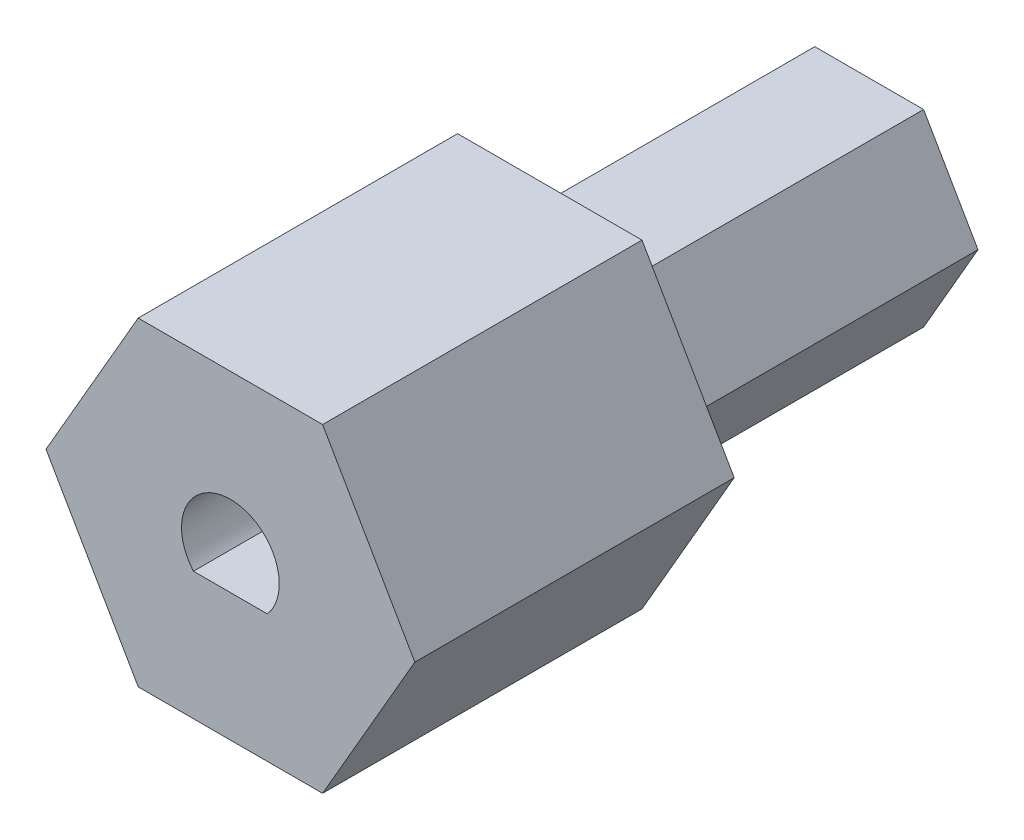
ISO-10303-21;
HEADER;
FILE_DESCRIPTION(('STEP AP214'),'2;1');
FILE_NAME('part.step','',(''),(''),'','','');
FILE_SCHEMA(('AUTOMOTIVE_DESIGN { 1 0 10303 214 1 1 1 1 }'));
ENDSEC;
DATA;
#1=APPLICATION_CONTEXT('core data for automotive mechanical design processes');
#2=APPLICATION_PROTOCOL_DEFINITION('international standard','automotive_design',2000,#1);
#3=PRODUCT_CONTEXT('',#1,'mechanical');
#4=PRODUCT('Part','Part','',(#3));
#5=PRODUCT_RELATED_PRODUCT_CATEGORY('part','',(#4));
#6=PRODUCT_DEFINITION_FORMATION('','',#4);
#7=PRODUCT_DEFINITION_CONTEXT('part definition',#1,'design');
#8=PRODUCT_DEFINITION('design','',#6,#7);
#9=PRODUCT_DEFINITION_SHAPE('','',#8);
#10=(LENGTH_UNIT() NAMED_UNIT(*) SI_UNIT(.MILLI.,.METRE.));
#11=(NAMED_UNIT(*) PLANE_ANGLE_UNIT() SI_UNIT($,.RADIAN.));
#12=(NAMED_UNIT(*) SI_UNIT($,.STERADIAN.) SOLID_ANGLE_UNIT());
#13=UNCERTAINTY_MEASURE_WITH_UNIT(LENGTH_MEASURE(1.E-05),#10,'distance_accuracy_value','');
#14=(GEOMETRIC_REPRESENTATION_CONTEXT(3) GLOBAL_UNCERTAINTY_ASSIGNED_CONTEXT((#13)) GLOBAL_UNIT_ASSIGNED_CONTEXT((#10,
#11,#12)) REPRESENTATION_CONTEXT('',''));
#15=CARTESIAN_POINT('',(0.,0.,0.));
#16=DIRECTION('',(0.,0.,1.));
#17=DIRECTION('',(1.,0.,0.));
#18=AXIS2_PLACEMENT_3D('',#15,#16,#17);
#19=CARTESIAN_POINT('',(0.,0.,20.));
#20=DIRECTION('',(0.,0.,1.));
#21=DIRECTION('',(1.,0.,0.));
#22=AXIS2_PLACEMENT_3D('',#19,#20,#21);
#23=PLANE('',#22);
#24=DIRECTION('',(-0.5,-0.866025403784439,0.));
#25=VECTOR('',#24,1.);
#26=CARTESIAN_POINT('',(-2.88675134594813,5.,20.));
#27=LINE('',#26,#25);
#28=CARTESIAN_POINT('',(-2.88675134594813,5.,20.));
#29=VERTEX_POINT('',#28);
#30=CARTESIAN_POINT('',(-5.77350269189626,0.,20.));
#31=VERTEX_POINT('',#30);
#32=EDGE_CURVE('E153',#29,#31,#27,.T.);
#33=ORIENTED_EDGE('',*,*,#32,.T.);
#34=DIRECTION('',(0.5,-0.866025403784439,0.));
#35=VECTOR('',#34,1.);
#36=CARTESIAN_POINT('',(-5.77350269189626,0.,20.));
#37=LINE('',#36,#35);
#38=CARTESIAN_POINT('',(-2.88675134594813,-5.,20.));
#39=VERTEX_POINT('',#38);
#40=EDGE_CURVE('E177',#31,#39,#37,.T.);
#41=ORIENTED_EDGE('',*,*,#40,.T.);
#42=DIRECTION('',(1.,0.,0.));
#43=VECTOR('',#42,1.);
#44=CARTESIAN_POINT('',(-2.88675134594813,-5.,20.));
#45=LINE('',#44,#43);
#46=CARTESIAN_POINT('',(2.88675134594813,-5.,20.));
#47=VERTEX_POINT('',#46);
#48=EDGE_CURVE('E180',#39,#47,#45,.T.);
#49=ORIENTED_EDGE('',*,*,#48,.T.);
#50=DIRECTION('',(0.5,0.866025403784439,0.));
#51=VECTOR('',#50,1.);
#52=CARTESIAN_POINT('',(2.88675134594813,-5.,20.));
#53=LINE('',#52,#51);
#54=CARTESIAN_POINT('',(5.77350269189626,0.,20.));
#55=VERTEX_POINT('',#54);
#56=EDGE_CURVE('E183',#47,#55,#53,.T.);
#57=ORIENTED_EDGE('',*,*,#56,.T.);
#58=DIRECTION('',(-0.5,0.866025403784438,0.));
#59=VECTOR('',#58,1.);
#60=CARTESIAN_POINT('',(5.77350269189626,0.,20.));
#61=LINE('',#60,#59);
#62=CARTESIAN_POINT('',(2.88675134594813,5.,20.));
#63=VERTEX_POINT('',#62);
#64=EDGE_CURVE('E186',#55,#63,#61,.T.);
#65=ORIENTED_EDGE('',*,*,#64,.T.);
#66=DIRECTION('',(-1.,0.,0.));
#67=VECTOR('',#66,1.);
#68=CARTESIAN_POINT('',(2.88675134594813,5.,20.));
#69=LINE('',#68,#67);
#70=EDGE_CURVE('E159',#63,#29,#69,.T.);
#71=ORIENTED_EDGE('',*,*,#70,.T.);
#72=EDGE_LOOP('',(#33,#41,#49,#57,#65,#71));
#73=FACE_BOUND('',#72,.T.);
#74=DIRECTION('',(1.,0.,0.));
#75=VECTOR('',#74,1.);
#76=CARTESIAN_POINT('',(-1.1579723658188,-1.,20.));
#77=LINE('',#76,#75);
#78=CARTESIAN_POINT('',(-1.1579723658188,-1.,20.));
#79=VERTEX_POINT('',#78);
#80=CARTESIAN_POINT('',(1.1579723658188,-1.,20.));
#81=VERTEX_POINT('',#80);
#82=EDGE_CURVE('E47',#79,#81,#77,.T.);
#83=ORIENTED_EDGE('',*,*,#82,.F.);
#84=CARTESIAN_POINT('',(0.,0.,20.));
#85=DIRECTION('',(0.,0.,-1.));
#86=DIRECTION('',(-1.,0.,0.));
#87=AXIS2_PLACEMENT_3D('',#84,#85,#86);
#88=CIRCLE('',#87,1.53);
#89=EDGE_CURVE('E148',#79,#81,#88,.T.);
#90=ORIENTED_EDGE('',*,*,#89,.T.);
#91=EDGE_LOOP('',(#83,#90));
#92=FACE_BOUND('',#91,.T.);
#93=ADVANCED_FACE('F32',(#73,#92),#23,.T.);
#94=CARTESIAN_POINT('',(1.7031832941094,-2.95,20.));
#95=DIRECTION('',(-0.866025403784439,0.5,0.));
#96=DIRECTION('',(-0.5,-0.866025403784439,0.));
#97=AXIS2_PLACEMENT_3D('',#94,#95,#96);
#98=PLANE('',#97);
#99=DIRECTION('',(0.5,0.866025403784439,0.));
#100=VECTOR('',#99,1.);
#101=CARTESIAN_POINT('',(1.7031832941094,-2.95,10.));
#102=LINE('',#101,#100);
#103=CARTESIAN_POINT('',(1.7031832941094,-2.95,10.));
#104=VERTEX_POINT('',#103);
#105=CARTESIAN_POINT('',(3.40636658821879,0.,10.));
#106=VERTEX_POINT('',#105);
#107=EDGE_CURVE('E212',#104,#106,#102,.T.);
#108=ORIENTED_EDGE('',*,*,#107,.F.);
#109=DIRECTION('',(0.,0.,-1.));
#110=VECTOR('',#109,1.);
#111=CARTESIAN_POINT('',(1.7031832941094,-2.95,20.));
#112=LINE('',#111,#110);
#113=CARTESIAN_POINT('',(1.7031832941094,-2.95,0.));
#114=VERTEX_POINT('',#113);
#115=EDGE_CURVE('E233',#104,#114,#112,.T.);
#116=ORIENTED_EDGE('',*,*,#115,.T.);
#117=DIRECTION('',(0.5,0.866025403784438,0.));
#118=VECTOR('',#117,1.);
#119=CARTESIAN_POINT('',(1.7031832941094,-2.95,0.));
#120=LINE('',#119,#118);
#121=CARTESIAN_POINT('',(3.40636658821879,0.,0.));
#122=VERTEX_POINT('',#121);
#123=EDGE_CURVE('E215',#114,#122,#120,.T.);
#124=ORIENTED_EDGE('',*,*,#123,.T.);
#125=DIRECTION('',(0.,0.,-1.));
#126=VECTOR('',#125,1.);
#127=CARTESIAN_POINT('',(3.40636658821879,0.,20.));
#128=LINE('',#127,#126);
#129=EDGE_CURVE('E40',#106,#122,#128,.T.);
#130=ORIENTED_EDGE('',*,*,#129,.F.);
#131=EDGE_LOOP('',(#108,#116,#124,#130));
#132=FACE_BOUND('',#131,.T.);
#133=ADVANCED_FACE('F34',(#132),#98,.F.);
#134=CARTESIAN_POINT('',(3.40636658821879,0.,20.));
#135=DIRECTION('',(-0.866025403784438,-0.5,0.));
#136=DIRECTION('',(0.5,-0.866025403784438,0.));
#137=AXIS2_PLACEMENT_3D('',#134,#135,#136);
#138=PLANE('',#137);
#139=DIRECTION('',(-0.5,0.866025403784438,0.));
#140=VECTOR('',#139,1.);
#141=CARTESIAN_POINT('',(3.40636658821879,0.,10.));
#142=LINE('',#141,#140);
#143=CARTESIAN_POINT('',(1.7031832941094,2.95,10.));
#144=VERTEX_POINT('',#143);
#145=EDGE_CURVE('E55',#106,#144,#142,.T.);
#146=ORIENTED_EDGE('',*,*,#145,.F.);
#147=ORIENTED_EDGE('',*,*,#129,.T.);
#148=DIRECTION('',(-0.5,0.866025403784438,0.));
#149=VECTOR('',#148,1.);
#150=CARTESIAN_POINT('',(3.40636658821879,0.,0.));
#151=LINE('',#150,#149);
#152=CARTESIAN_POINT('',(1.7031832941094,2.95,0.));
#153=VERTEX_POINT('',#152);
#154=EDGE_CURVE('E218',#122,#153,#151,.T.);
#155=ORIENTED_EDGE('',*,*,#154,.T.);
#156=DIRECTION('',(0.,0.,-1.));
#157=VECTOR('',#156,1.);
#158=CARTESIAN_POINT('',(1.7031832941094,2.95,20.));
#159=LINE('',#158,#157);
#160=EDGE_CURVE('E241',#144,#153,#159,.T.);
#161=ORIENTED_EDGE('',*,*,#160,.F.);
#162=EDGE_LOOP('',(#146,#147,#155,#161));
#163=FACE_BOUND('',#162,.T.);
#164=ADVANCED_FACE('F243',(#163),#138,.F.);
#165=CARTESIAN_POINT('',(1.7031832941094,2.95,20.));
#166=DIRECTION('',(0.,-1.,0.));
#167=DIRECTION('',(0.,0.,-1.));
#168=AXIS2_PLACEMENT_3D('',#165,#166,#167);
#169=PLANE('',#168);
#170=DIRECTION('',(-1.,0.,0.));
#171=VECTOR('',#170,1.);
#172=CARTESIAN_POINT('',(1.7031832941094,2.95,10.));
#173=LINE('',#172,#171);
#174=CARTESIAN_POINT('',(-1.7031832941094,2.95,10.));
#175=VERTEX_POINT('',#174);
#176=EDGE_CURVE('E208',#144,#175,#173,.T.);
#177=ORIENTED_EDGE('',*,*,#176,.F.);
#178=ORIENTED_EDGE('',*,*,#160,.T.);
#179=DIRECTION('',(-1.,0.,0.));
#180=VECTOR('',#179,1.);
#181=CARTESIAN_POINT('',(1.7031832941094,2.95,0.));
#182=LINE('',#181,#180);
#183=CARTESIAN_POINT('',(-1.7031832941094,2.95,0.));
#184=VERTEX_POINT('',#183);
#185=EDGE_CURVE('E221',#153,#184,#182,.T.);
#186=ORIENTED_EDGE('',*,*,#185,.T.);
#187=DIRECTION('',(0.,0.,-1.));
#188=VECTOR('',#187,1.);
#189=CARTESIAN_POINT('',(-1.7031832941094,2.95,20.));
#190=LINE('',#189,#188);
#191=EDGE_CURVE('E239',#175,#184,#190,.T.);
#192=ORIENTED_EDGE('',*,*,#191,.F.);
#193=EDGE_LOOP('',(#177,#178,#186,#192));
#194=FACE_BOUND('',#193,.T.);
#195=ADVANCED_FACE('F263',(#194),#169,.F.);
#196=CARTESIAN_POINT('',(-1.7031832941094,2.95,20.));
#197=DIRECTION('',(0.866025403784439,-0.5,0.));
#198=DIRECTION('',(0.5,0.866025403784439,0.));
#199=AXIS2_PLACEMENT_3D('',#196,#197,#198);
#200=PLANE('',#199);
#201=DIRECTION('',(-0.5,-0.866025403784439,0.));
#202=VECTOR('',#201,1.);
#203=CARTESIAN_POINT('',(-1.7031832941094,2.95,10.));
#204=LINE('',#203,#202);
#205=CARTESIAN_POINT('',(-3.40636658821879,0.,10.));
#206=VERTEX_POINT('',#205);
#207=EDGE_CURVE('E205',#175,#206,#204,.T.);
#208=ORIENTED_EDGE('',*,*,#207,.F.);
#209=ORIENTED_EDGE('',*,*,#191,.T.);
#210=DIRECTION('',(-0.5,-0.866025403784438,0.));
#211=VECTOR('',#210,1.);
#212=CARTESIAN_POINT('',(-1.7031832941094,2.95,0.));
#213=LINE('',#212,#211);
#214=CARTESIAN_POINT('',(-3.40636658821879,0.,0.));
#215=VERTEX_POINT('',#214);
#216=EDGE_CURVE('E224',#184,#215,#213,.T.);
#217=ORIENTED_EDGE('',*,*,#216,.T.);
#218=DIRECTION('',(0.,0.,-1.));
#219=VECTOR('',#218,1.);
#220=CARTESIAN_POINT('',(-3.40636658821879,0.,20.));
#221=LINE('',#220,#219);
#222=EDGE_CURVE('E237',#206,#215,#221,.T.);
#223=ORIENTED_EDGE('',*,*,#222,.F.);
#224=EDGE_LOOP('',(#208,#209,#217,#223));
#225=FACE_BOUND('',#224,.T.);
#226=ADVANCED_FACE('F260',(#225),#200,.F.);
#227=CARTESIAN_POINT('',(-3.40636658821879,0.,20.));
#228=DIRECTION('',(0.866025403784438,0.5,0.));
#229=DIRECTION('',(-0.5,0.866025403784438,0.));
#230=AXIS2_PLACEMENT_3D('',#227,#228,#229);
#231=PLANE('',#230);
#232=DIRECTION('',(0.5,-0.866025403784438,0.));
#233=VECTOR('',#232,1.);
#234=CARTESIAN_POINT('',(-3.40636658821879,0.,10.));
#235=LINE('',#234,#233);
#236=CARTESIAN_POINT('',(-1.7031832941094,-2.95,10.));
#237=VERTEX_POINT('',#236);
#238=EDGE_CURVE('E193',#206,#237,#235,.T.);
#239=ORIENTED_EDGE('',*,*,#238,.F.);
#240=ORIENTED_EDGE('',*,*,#222,.T.);
#241=DIRECTION('',(0.5,-0.866025403784438,0.));
#242=VECTOR('',#241,1.);
#243=CARTESIAN_POINT('',(-3.40636658821879,0.,0.));
#244=LINE('',#243,#242);
#245=CARTESIAN_POINT('',(-1.7031832941094,-2.95,0.));
#246=VERTEX_POINT('',#245);
#247=EDGE_CURVE('E227',#215,#246,#244,.T.);
#248=ORIENTED_EDGE('',*,*,#247,.T.);
#249=DIRECTION('',(0.,0.,-1.));
#250=VECTOR('',#249,1.);
#251=CARTESIAN_POINT('',(-1.7031832941094,-2.95,20.));
#252=LINE('',#251,#250);
#253=EDGE_CURVE('E235',#237,#246,#252,.T.);
#254=ORIENTED_EDGE('',*,*,#253,.F.);
#255=EDGE_LOOP('',(#239,#240,#248,#254));
#256=FACE_BOUND('',#255,.T.);
#257=ADVANCED_FACE('F257',(#256),#231,.F.);
#258=CARTESIAN_POINT('',(-1.7031832941094,-2.95,20.));
#259=DIRECTION('',(0.,1.,0.));
#260=DIRECTION('',(-1.,0.,0.));
#261=AXIS2_PLACEMENT_3D('',#258,#259,#260);
#262=PLANE('',#261);
#263=DIRECTION('',(1.,0.,0.));
#264=VECTOR('',#263,1.);
#265=CARTESIAN_POINT('',(-1.7031832941094,-2.95,10.));
#266=LINE('',#265,#264);
#267=EDGE_CURVE('E11',#237,#104,#266,.T.);
#268=ORIENTED_EDGE('',*,*,#267,.F.);
#269=ORIENTED_EDGE('',*,*,#253,.T.);
#270=DIRECTION('',(1.,0.,0.));
#271=VECTOR('',#270,1.);
#272=CARTESIAN_POINT('',(-1.7031832941094,-2.95,0.));
#273=LINE('',#272,#271);
#274=EDGE_CURVE('E230',#246,#114,#273,.T.);
#275=ORIENTED_EDGE('',*,*,#274,.T.);
#276=ORIENTED_EDGE('',*,*,#115,.F.);
#277=EDGE_LOOP('',(#268,#269,#275,#276));
#278=FACE_BOUND('',#277,.T.);
#279=ADVANCED_FACE('F253',(#278),#262,.F.);
#280=CARTESIAN_POINT('',(0.,0.,0.));
#281=DIRECTION('',(0.,0.,1.));
#282=DIRECTION('',(1.,0.,0.));
#283=AXIS2_PLACEMENT_3D('',#280,#281,#282);
#284=PLANE('',#283);
#285=ORIENTED_EDGE('',*,*,#123,.F.);
#286=ORIENTED_EDGE('',*,*,#274,.F.);
#287=ORIENTED_EDGE('',*,*,#247,.F.);
#288=ORIENTED_EDGE('',*,*,#216,.F.);
#289=ORIENTED_EDGE('',*,*,#185,.F.);
#290=ORIENTED_EDGE('',*,*,#154,.F.);
#291=EDGE_LOOP('',(#285,#286,#287,#288,#289,#290));
#292=FACE_BOUND('',#291,.T.);
#293=ADVANCED_FACE('F249',(#292),#284,.F.);
#294=CARTESIAN_POINT('',(0.,0.,10.));
#295=DIRECTION('',(0.,0.,1.));
#296=DIRECTION('',(1.,0.,0.));
#297=AXIS2_PLACEMENT_3D('',#294,#295,#296);
#298=PLANE('',#297);
#299=DIRECTION('',(-0.5,-0.866025403784439,0.));
#300=VECTOR('',#299,1.);
#301=CARTESIAN_POINT('',(-2.88675134594813,5.,10.));
#302=LINE('',#301,#300);
#303=CARTESIAN_POINT('',(-2.88675134594813,5.,10.));
#304=VERTEX_POINT('',#303);
#305=CARTESIAN_POINT('',(-5.77350269189626,0.,10.));
#306=VERTEX_POINT('',#305);
#307=EDGE_CURVE('E155',#304,#306,#302,.T.);
#308=ORIENTED_EDGE('',*,*,#307,.F.);
#309=DIRECTION('',(-1.,0.,0.));
#310=VECTOR('',#309,1.);
#311=CARTESIAN_POINT('',(2.88675134594813,5.,10.));
#312=LINE('',#311,#310);
#313=CARTESIAN_POINT('',(2.88675134594813,5.,10.));
#314=VERTEX_POINT('',#313);
#315=EDGE_CURVE('E171',#314,#304,#312,.T.);
#316=ORIENTED_EDGE('',*,*,#315,.F.);
#317=DIRECTION('',(-0.5,0.866025403784438,0.));
#318=VECTOR('',#317,1.);
#319=CARTESIAN_POINT('',(5.77350269189626,0.,10.));
#320=LINE('',#319,#318);
#321=CARTESIAN_POINT('',(5.77350269189626,0.,10.));
#322=VERTEX_POINT('',#321);
#323=EDGE_CURVE('E168',#322,#314,#320,.T.);
#324=ORIENTED_EDGE('',*,*,#323,.F.);
#325=DIRECTION('',(0.5,0.866025403784439,0.));
#326=VECTOR('',#325,1.);
#327=CARTESIAN_POINT('',(2.88675134594813,-5.,10.));
#328=LINE('',#327,#326);
#329=CARTESIAN_POINT('',(2.88675134594813,-5.,10.));
#330=VERTEX_POINT('',#329);
#331=EDGE_CURVE('E165',#330,#322,#328,.T.);
#332=ORIENTED_EDGE('',*,*,#331,.F.);
#333=DIRECTION('',(1.,0.,0.));
#334=VECTOR('',#333,1.);
#335=CARTESIAN_POINT('',(-2.88675134594813,-5.,10.));
#336=LINE('',#335,#334);
#337=CARTESIAN_POINT('',(-2.88675134594813,-5.,10.));
#338=VERTEX_POINT('',#337);
#339=EDGE_CURVE('E162',#338,#330,#336,.T.);
#340=ORIENTED_EDGE('',*,*,#339,.F.);
#341=DIRECTION('',(0.5,-0.866025403784439,0.));
#342=VECTOR('',#341,1.);
#343=CARTESIAN_POINT('',(-5.77350269189626,0.,10.));
#344=LINE('',#343,#342);
#345=EDGE_CURVE('E158',#306,#338,#344,.T.);
#346=ORIENTED_EDGE('',*,*,#345,.F.);
#347=EDGE_LOOP('',(#308,#316,#324,#332,#340,#346));
#348=FACE_BOUND('',#347,.T.);
#349=ORIENTED_EDGE('',*,*,#267,.T.);
#350=ORIENTED_EDGE('',*,*,#107,.T.);
#351=ORIENTED_EDGE('',*,*,#145,.T.);
#352=ORIENTED_EDGE('',*,*,#176,.T.);
#353=ORIENTED_EDGE('',*,*,#207,.T.);
#354=ORIENTED_EDGE('',*,*,#238,.T.);
#355=EDGE_LOOP('',(#349,#350,#351,#352,#353,#354));
#356=FACE_BOUND('',#355,.T.);
#357=ADVANCED_FACE('F265',(#348,#356),#298,.F.);
#358=CARTESIAN_POINT('',(-2.88675134594813,5.,10.));
#359=DIRECTION('',(-0.866025403784439,0.5,0.));
#360=DIRECTION('',(-0.5,-0.866025403784439,0.));
#361=AXIS2_PLACEMENT_3D('',#358,#359,#360);
#362=PLANE('',#361);
#363=ORIENTED_EDGE('',*,*,#32,.F.);
#364=DIRECTION('',(0.,0.,1.));
#365=VECTOR('',#364,1.);
#366=CARTESIAN_POINT('',(-2.88675134594813,5.,10.));
#367=LINE('',#366,#365);
#368=EDGE_CURVE('E191',#304,#29,#367,.T.);
#369=ORIENTED_EDGE('',*,*,#368,.F.);
#370=ORIENTED_EDGE('',*,*,#307,.T.);
#371=DIRECTION('',(0.,0.,1.));
#372=VECTOR('',#371,1.);
#373=CARTESIAN_POINT('',(-5.77350269189626,0.,10.));
#374=LINE('',#373,#372);
#375=EDGE_CURVE('E174',#306,#31,#374,.T.);
#376=ORIENTED_EDGE('',*,*,#375,.T.);
#377=EDGE_LOOP('',(#363,#369,#370,#376));
#378=FACE_BOUND('',#377,.T.);
#379=ADVANCED_FACE('F267',(#378),#362,.T.);
#380=CARTESIAN_POINT('',(2.88675134594813,5.,10.));
#381=DIRECTION('',(0.,1.,0.));
#382=DIRECTION('',(0.,0.,1.));
#383=AXIS2_PLACEMENT_3D('',#380,#381,#382);
#384=PLANE('',#383);
#385=ORIENTED_EDGE('',*,*,#70,.F.);
#386=DIRECTION('',(0.,0.,1.));
#387=VECTOR('',#386,1.);
#388=CARTESIAN_POINT('',(2.88675134594813,5.,10.));
#389=LINE('',#388,#387);
#390=EDGE_CURVE('E194',#314,#63,#389,.T.);
#391=ORIENTED_EDGE('',*,*,#390,.F.);
#392=ORIENTED_EDGE('',*,*,#315,.T.);
#393=ORIENTED_EDGE('',*,*,#368,.T.);
#394=EDGE_LOOP('',(#385,#391,#392,#393));
#395=FACE_BOUND('',#394,.T.);
#396=ADVANCED_FACE('F274',(#395),#384,.T.);
#397=CARTESIAN_POINT('',(5.77350269189626,0.,10.));
#398=DIRECTION('',(0.866025403784438,0.5,0.));
#399=DIRECTION('',(-0.5,0.866025403784438,0.));
#400=AXIS2_PLACEMENT_3D('',#397,#398,#399);
#401=PLANE('',#400);
#402=ORIENTED_EDGE('',*,*,#64,.F.);
#403=DIRECTION('',(0.,0.,1.));
#404=VECTOR('',#403,1.);
#405=CARTESIAN_POINT('',(5.77350269189626,0.,10.));
#406=LINE('',#405,#404);
#407=EDGE_CURVE('E196',#322,#55,#406,.T.);
#408=ORIENTED_EDGE('',*,*,#407,.F.);
#409=ORIENTED_EDGE('',*,*,#323,.T.);
#410=ORIENTED_EDGE('',*,*,#390,.T.);
#411=EDGE_LOOP('',(#402,#408,#409,#410));
#412=FACE_BOUND('',#411,.T.);
#413=ADVANCED_FACE('F347',(#412),#401,.T.);
#414=CARTESIAN_POINT('',(2.88675134594813,-5.,10.));
#415=DIRECTION('',(0.866025403784439,-0.5,0.));
#416=DIRECTION('',(0.5,0.866025403784439,0.));
#417=AXIS2_PLACEMENT_3D('',#414,#415,#416);
#418=PLANE('',#417);
#419=ORIENTED_EDGE('',*,*,#56,.F.);
#420=DIRECTION('',(0.,0.,1.));
#421=VECTOR('',#420,1.);
#422=CARTESIAN_POINT('',(2.88675134594813,-5.,10.));
#423=LINE('',#422,#421);
#424=EDGE_CURVE('E198',#330,#47,#423,.T.);
#425=ORIENTED_EDGE('',*,*,#424,.F.);
#426=ORIENTED_EDGE('',*,*,#331,.T.);
#427=ORIENTED_EDGE('',*,*,#407,.T.);
#428=EDGE_LOOP('',(#419,#425,#426,#427));
#429=FACE_BOUND('',#428,.T.);
#430=ADVANCED_FACE('F355',(#429),#418,.T.);
#431=CARTESIAN_POINT('',(-2.88675134594813,-5.,10.));
#432=DIRECTION('',(0.,-1.,0.));
#433=DIRECTION('',(1.,0.,0.));
#434=AXIS2_PLACEMENT_3D('',#431,#432,#433);
#435=PLANE('',#434);
#436=ORIENTED_EDGE('',*,*,#48,.F.);
#437=DIRECTION('',(0.,0.,1.));
#438=VECTOR('',#437,1.);
#439=CARTESIAN_POINT('',(-2.88675134594813,-5.,10.));
#440=LINE('',#439,#438);
#441=EDGE_CURVE('E200',#338,#39,#440,.T.);
#442=ORIENTED_EDGE('',*,*,#441,.F.);
#443=ORIENTED_EDGE('',*,*,#339,.T.);
#444=ORIENTED_EDGE('',*,*,#424,.T.);
#445=EDGE_LOOP('',(#436,#442,#443,#444));
#446=FACE_BOUND('',#445,.T.);
#447=ADVANCED_FACE('F364',(#446),#435,.T.);
#448=CARTESIAN_POINT('',(-5.77350269189626,0.,10.));
#449=DIRECTION('',(-0.866025403784439,-0.5,0.));
#450=DIRECTION('',(0.5,-0.866025403784439,0.));
#451=AXIS2_PLACEMENT_3D('',#448,#449,#450);
#452=PLANE('',#451);
#453=ORIENTED_EDGE('',*,*,#40,.F.);
#454=ORIENTED_EDGE('',*,*,#375,.F.);
#455=ORIENTED_EDGE('',*,*,#345,.T.);
#456=ORIENTED_EDGE('',*,*,#441,.T.);
#457=EDGE_LOOP('',(#453,#454,#455,#456));
#458=FACE_BOUND('',#457,.T.);
#459=ADVANCED_FACE('F373',(#458),#452,.T.);
#460=CARTESIAN_POINT('',(-1.1579723658188,-1.,9.));
#461=DIRECTION('',(0.,-1.,0.));
#462=DIRECTION('',(0.,0.,-1.));
#463=AXIS2_PLACEMENT_3D('',#460,#461,#462);
#464=PLANE('',#463);
#465=ORIENTED_EDGE('',*,*,#82,.T.);
#466=DIRECTION('',(0.,0.,1.));
#467=VECTOR('',#466,1.);
#468=CARTESIAN_POINT('',(1.1579723658188,-1.,9.));
#469=LINE('',#468,#467);
#470=CARTESIAN_POINT('',(1.1579723658188,-1.,9.));
#471=VERTEX_POINT('',#470);
#472=EDGE_CURVE('E137',#471,#81,#469,.T.);
#473=ORIENTED_EDGE('',*,*,#472,.F.);
#474=DIRECTION('',(1.,0.,0.));
#475=VECTOR('',#474,1.);
#476=CARTESIAN_POINT('',(-1.1579723658188,-1.,9.));
#477=LINE('',#476,#475);
#478=CARTESIAN_POINT('',(-1.1579723658188,-1.,9.));
#479=VERTEX_POINT('',#478);
#480=EDGE_CURVE('E143',#479,#471,#477,.T.);
#481=ORIENTED_EDGE('',*,*,#480,.F.);
#482=DIRECTION('',(0.,0.,1.));
#483=VECTOR('',#482,1.);
#484=CARTESIAN_POINT('',(-1.1579723658188,-1.,9.));
#485=LINE('',#484,#483);
#486=EDGE_CURVE('E139',#479,#79,#485,.T.);
#487=ORIENTED_EDGE('',*,*,#486,.T.);
#488=EDGE_LOOP('',(#465,#473,#481,#487));
#489=FACE_BOUND('',#488,.T.);
#490=ADVANCED_FACE('F145',(#489),#464,.F.);
#491=CARTESIAN_POINT('',(0.,0.,9.));
#492=DIRECTION('',(0.,0.,1.));
#493=DIRECTION('',(1.,0.,0.));
#494=AXIS2_PLACEMENT_3D('',#491,#492,#493);
#495=CYLINDRICAL_SURFACE('',#494,1.53);
#496=ORIENTED_EDGE('',*,*,#89,.F.);
#497=ORIENTED_EDGE('',*,*,#486,.F.);
#498=CARTESIAN_POINT('',(0.,0.,9.));
#499=DIRECTION('',(0.,0.,-1.));
#500=DIRECTION('',(-1.,0.,0.));
#501=AXIS2_PLACEMENT_3D('',#498,#499,#500);
#502=CIRCLE('',#501,1.53);
#503=EDGE_CURVE('E134',#479,#471,#502,.T.);
#504=ORIENTED_EDGE('',*,*,#503,.T.);
#505=ORIENTED_EDGE('',*,*,#472,.T.);
#506=EDGE_LOOP('',(#496,#497,#504,#505));
#507=FACE_BOUND('',#506,.T.);
#508=ADVANCED_FACE('F136',(#507),#495,.F.);
#509=CARTESIAN_POINT('',(0.,0.,9.));
#510=DIRECTION('',(0.,0.,-1.));
#511=DIRECTION('',(-1.,0.,0.));
#512=AXIS2_PLACEMENT_3D('',#509,#510,#511);
#513=PLANE('',#512);
#514=ORIENTED_EDGE('',*,*,#480,.T.);
#515=ORIENTED_EDGE('',*,*,#503,.F.);
#516=EDGE_LOOP('',(#514,#515));
#517=FACE_BOUND('',#516,.T.);
#518=ADVANCED_FACE('F147',(#517),#513,.F.);
#519=CLOSED_SHELL('',(#93,#133,#164,#195,#226,#257,#279,#293,#357,#379,#396,#413,#430,#447,#459,
#490,#508,#518));
#520=MANIFOLD_SOLID_BREP('B2',#519);
#521=ADVANCED_BREP_SHAPE_REPRESENTATION('',(#18,#520),#14);
#522=SHAPE_DEFINITION_REPRESENTATION(#9,#521);
ENDSEC;
END-ISO-10303-21;
